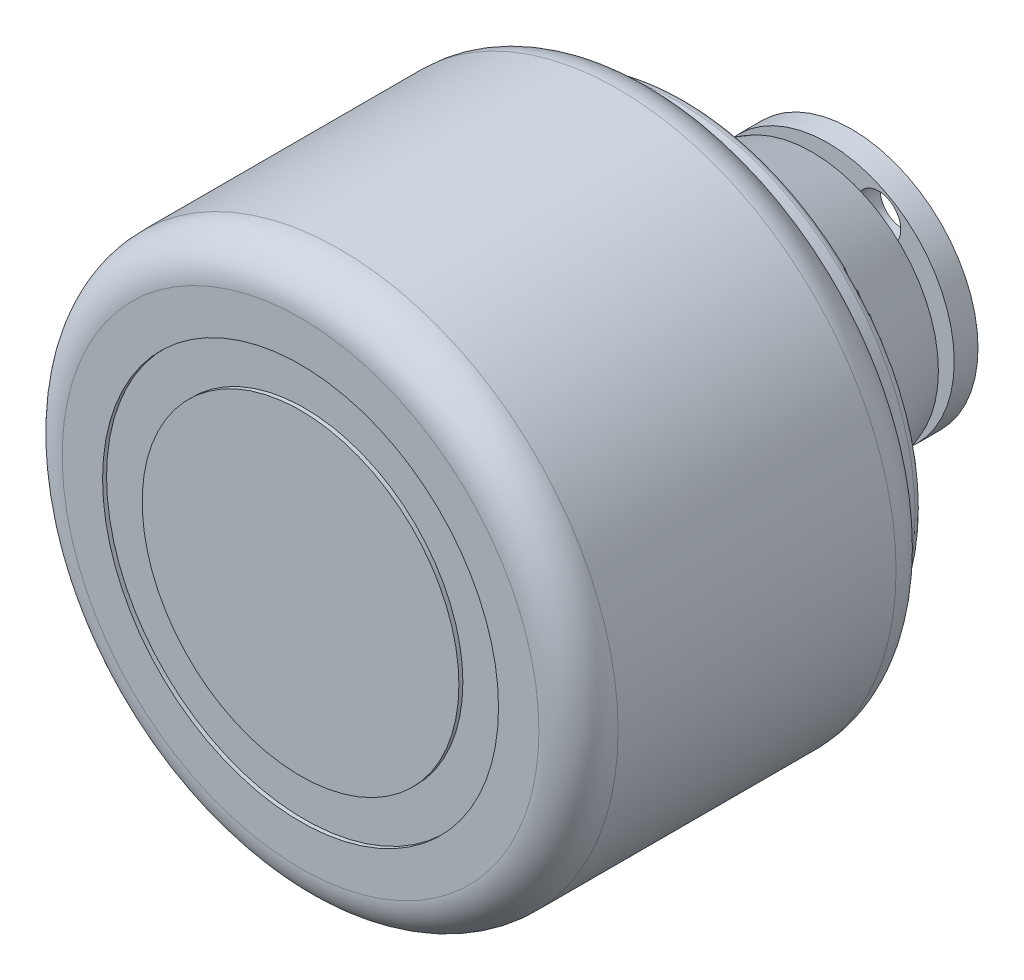
ISO-10303-21;
HEADER;
FILE_DESCRIPTION(('STEP AP214'),'2;1');
FILE_NAME('part.step','',(''),(''),'','','');
FILE_SCHEMA(('AUTOMOTIVE_DESIGN { 1 0 10303 214 1 1 1 1 }'));
ENDSEC;
DATA;
#1=APPLICATION_CONTEXT('core data for automotive mechanical design processes');
#2=APPLICATION_PROTOCOL_DEFINITION('international standard','automotive_design',2000,#1);
#3=PRODUCT_CONTEXT('',#1,'mechanical');
#4=PRODUCT('Part','Part','',(#3));
#5=PRODUCT_RELATED_PRODUCT_CATEGORY('part','',(#4));
#6=PRODUCT_DEFINITION_FORMATION('','',#4);
#7=PRODUCT_DEFINITION_CONTEXT('part definition',#1,'design');
#8=PRODUCT_DEFINITION('design','',#6,#7);
#9=PRODUCT_DEFINITION_SHAPE('','',#8);
#10=(LENGTH_UNIT() NAMED_UNIT(*) SI_UNIT(.MILLI.,.METRE.));
#11=(NAMED_UNIT(*) PLANE_ANGLE_UNIT() SI_UNIT($,.RADIAN.));
#12=(NAMED_UNIT(*) SI_UNIT($,.STERADIAN.) SOLID_ANGLE_UNIT());
#13=UNCERTAINTY_MEASURE_WITH_UNIT(LENGTH_MEASURE(1.E-05),#10,'distance_accuracy_value','');
#14=(GEOMETRIC_REPRESENTATION_CONTEXT(3) GLOBAL_UNCERTAINTY_ASSIGNED_CONTEXT((#13)) GLOBAL_UNIT_ASSIGNED_CONTEXT((#10,
#11,#12)) REPRESENTATION_CONTEXT('',''));
#15=CARTESIAN_POINT('',(0.,0.,0.));
#16=DIRECTION('',(0.,0.,1.));
#17=DIRECTION('',(1.,0.,0.));
#18=AXIS2_PLACEMENT_3D('',#15,#16,#17);
#19=CARTESIAN_POINT('',(0.,0.,45.1));
#20=DIRECTION('',(0.,0.,-1.));
#21=DIRECTION('',(-1.,0.,0.));
#22=AXIS2_PLACEMENT_3D('',#19,#20,#21);
#23=CYLINDRICAL_SURFACE('',#22,35.1);
#24=CARTESIAN_POINT('',(0.,0.,40.1));
#25=DIRECTION('',(0.,0.,1.));
#26=DIRECTION('',(1.,0.,0.));
#27=AXIS2_PLACEMENT_3D('',#24,#25,#26);
#28=CIRCLE('',#27,35.1);
#29=CARTESIAN_POINT('',(35.1,0.,40.1));
#30=VERTEX_POINT('',#29);
#31=EDGE_CURVE('E65',#30,#30,#28,.F.);
#32=ORIENTED_EDGE('',*,*,#31,.T.);
#33=EDGE_LOOP('',(#32));
#34=FACE_BOUND('',#33,.T.);
#35=CARTESIAN_POINT('',(0.,0.,5.));
#36=DIRECTION('',(0.,0.,1.));
#37=DIRECTION('',(1.,0.,0.));
#38=AXIS2_PLACEMENT_3D('',#35,#36,#37);
#39=CIRCLE('',#38,35.1);
#40=CARTESIAN_POINT('',(35.1,0.,5.));
#41=VERTEX_POINT('',#40);
#42=EDGE_CURVE('E68',#41,#41,#39,.T.);
#43=ORIENTED_EDGE('',*,*,#42,.T.);
#44=EDGE_LOOP('',(#43));
#45=FACE_BOUND('',#44,.T.);
#46=ADVANCED_FACE('F42',(#34,#45),#23,.T.);
#47=CARTESIAN_POINT('',(0.,0.,45.1));
#48=DIRECTION('',(0.,0.,1.));
#49=DIRECTION('',(1.,0.,0.));
#50=AXIS2_PLACEMENT_3D('',#47,#48,#49);
#51=PLANE('',#50);
#52=CARTESIAN_POINT('',(0.,0.,45.1));
#53=DIRECTION('',(0.,0.,1.));
#54=DIRECTION('',(1.,0.,0.));
#55=AXIS2_PLACEMENT_3D('',#52,#53,#54);
#56=CIRCLE('',#55,25.);
#57=CARTESIAN_POINT('',(25.,0.,45.1));
#58=VERTEX_POINT('',#57);
#59=EDGE_CURVE('E114',#58,#58,#56,.T.);
#60=ORIENTED_EDGE('',*,*,#59,.F.);
#61=EDGE_LOOP('',(#60));
#62=FACE_BOUND('',#61,.T.);
#63=CARTESIAN_POINT('',(0.,0.,45.1));
#64=DIRECTION('',(0.,0.,1.));
#65=DIRECTION('',(1.,0.,0.));
#66=AXIS2_PLACEMENT_3D('',#63,#64,#65);
#67=CIRCLE('',#66,30.1);
#68=CARTESIAN_POINT('',(30.1,0.,45.1));
#69=VERTEX_POINT('',#68);
#70=EDGE_CURVE('E71',#69,#69,#67,.T.);
#71=ORIENTED_EDGE('',*,*,#70,.T.);
#72=EDGE_LOOP('',(#71));
#73=FACE_BOUND('',#72,.T.);
#74=ADVANCED_FACE('F142',(#62,#73),#51,.T.);
#75=CARTESIAN_POINT('',(0.,0.,0.));
#76=DIRECTION('',(0.,0.,1.));
#77=DIRECTION('',(1.,0.,0.));
#78=AXIS2_PLACEMENT_3D('',#75,#76,#77);
#79=PLANE('',#78);
#80=CARTESIAN_POINT('',(0.,0.,0.));
#81=DIRECTION('',(0.,0.,1.));
#82=DIRECTION('',(1.,0.,0.));
#83=AXIS2_PLACEMENT_3D('',#80,#81,#82);
#84=CIRCLE('',#83,30.1);
#85=CARTESIAN_POINT('',(30.1,0.,0.));
#86=VERTEX_POINT('',#85);
#87=EDGE_CURVE('E62',#86,#86,#84,.F.);
#88=ORIENTED_EDGE('',*,*,#87,.T.);
#89=EDGE_LOOP('',(#88));
#90=FACE_BOUND('',#89,.T.);
#91=CARTESIAN_POINT('',(0.,0.,0.));
#92=DIRECTION('',(0.,0.,1.));
#93=DIRECTION('',(1.,0.,0.));
#94=AXIS2_PLACEMENT_3D('',#91,#92,#93);
#95=CIRCLE('',#94,30.);
#96=CARTESIAN_POINT('',(30.,0.,0.));
#97=VERTEX_POINT('',#96);
#98=EDGE_CURVE('E74',#97,#97,#95,.T.);
#99=ORIENTED_EDGE('',*,*,#98,.T.);
#100=EDGE_LOOP('',(#99));
#101=FACE_BOUND('',#100,.T.);
#102=ADVANCED_FACE('F145',(#90,#101),#79,.F.);
#103=CARTESIAN_POINT('',(0.,0.,-3.5));
#104=DIRECTION('',(0.,0.,1.));
#105=DIRECTION('',(1.,0.,0.));
#106=AXIS2_PLACEMENT_3D('',#103,#104,#105);
#107=CYLINDRICAL_SURFACE('',#106,30.);
#108=CARTESIAN_POINT('',(0.,0.,-2.5));
#109=DIRECTION('',(0.,0.,1.));
#110=DIRECTION('',(1.,0.,0.));
#111=AXIS2_PLACEMENT_3D('',#108,#109,#110);
#112=CIRCLE('',#111,30.);
#113=CARTESIAN_POINT('',(30.,0.,-2.5));
#114=VERTEX_POINT('',#113);
#115=EDGE_CURVE('E49',#114,#114,#112,.T.);
#116=ORIENTED_EDGE('',*,*,#115,.T.);
#117=EDGE_LOOP('',(#116));
#118=FACE_BOUND('',#117,.T.);
#119=ORIENTED_EDGE('',*,*,#98,.F.);
#120=EDGE_LOOP('',(#119));
#121=FACE_BOUND('',#120,.T.);
#122=ADVANCED_FACE('F175',(#118,#121),#107,.T.);
#123=CARTESIAN_POINT('',(0.,0.,-3.5));
#124=DIRECTION('',(0.,0.,1.));
#125=DIRECTION('',(1.,0.,0.));
#126=AXIS2_PLACEMENT_3D('',#123,#124,#125);
#127=PLANE('',#126);
#128=CARTESIAN_POINT('',(0.,0.,-3.5));
#129=DIRECTION('',(0.,0.,1.));
#130=DIRECTION('',(1.,0.,0.));
#131=AXIS2_PLACEMENT_3D('',#128,#129,#130);
#132=CIRCLE('',#131,29.);
#133=CARTESIAN_POINT('',(29.,0.,-3.5));
#134=VERTEX_POINT('',#133);
#135=EDGE_CURVE('E12',#134,#134,#132,.F.);
#136=ORIENTED_EDGE('',*,*,#135,.T.);
#137=EDGE_LOOP('',(#136));
#138=FACE_BOUND('',#137,.T.);
#139=CARTESIAN_POINT('',(0.,0.,-3.5));
#140=DIRECTION('',(0.,0.,1.));
#141=DIRECTION('',(1.,0.,0.));
#142=AXIS2_PLACEMENT_3D('',#139,#140,#141);
#143=CIRCLE('',#142,20.);
#144=CARTESIAN_POINT('',(20.,0.,-3.5));
#145=VERTEX_POINT('',#144);
#146=EDGE_CURVE('E77',#145,#145,#143,.T.);
#147=ORIENTED_EDGE('',*,*,#146,.T.);
#148=EDGE_LOOP('',(#147));
#149=FACE_BOUND('',#148,.T.);
#150=ADVANCED_FACE('F180',(#138,#149),#127,.F.);
#151=CARTESIAN_POINT('',(0.,0.,-24.5));
#152=DIRECTION('',(0.,0.,1.));
#153=DIRECTION('',(1.,0.,0.));
#154=AXIS2_PLACEMENT_3D('',#151,#152,#153);
#155=CYLINDRICAL_SURFACE('',#154,20.);
#156=CARTESIAN_POINT('',(0.,0.,-4.2159957694468));
#157=DIRECTION('',(0.,0.,1.));
#158=DIRECTION('',(1.,0.,0.));
#159=AXIS2_PLACEMENT_3D('',#156,#157,#158);
#160=CIRCLE('',#159,20.);
#161=CARTESIAN_POINT('',(20.,0.,-4.2159957694468));
#162=VERTEX_POINT('',#161);
#163=EDGE_CURVE('E57',#162,#162,#160,.T.);
#164=ORIENTED_EDGE('',*,*,#163,.T.);
#165=EDGE_LOOP('',(#164));
#166=FACE_BOUND('',#165,.T.);
#167=ORIENTED_EDGE('',*,*,#146,.F.);
#168=EDGE_LOOP('',(#167));
#169=FACE_BOUND('',#168,.T.);
#170=ADVANCED_FACE('F183',(#166,#169),#155,.T.);
#171=CARTESIAN_POINT('',(0.,0.,-24.5));
#172=DIRECTION('',(0.,0.,1.));
#173=DIRECTION('',(1.,0.,0.));
#174=AXIS2_PLACEMENT_3D('',#171,#172,#173);
#175=CYLINDRICAL_SURFACE('',#174,4.);
#176=CARTESIAN_POINT('',(0.,0.,-19.5));
#177=DIRECTION('',(0.,0.,1.));
#178=DIRECTION('',(1.,0.,0.));
#179=AXIS2_PLACEMENT_3D('',#176,#177,#178);
#180=CIRCLE('',#179,4.);
#181=CARTESIAN_POINT('',(4.,0.,-19.5));
#182=VERTEX_POINT('',#181);
#183=EDGE_CURVE('E92',#182,#182,#180,.T.);
#184=ORIENTED_EDGE('',*,*,#183,.F.);
#185=EDGE_LOOP('',(#184));
#186=FACE_BOUND('',#185,.T.);
#187=CARTESIAN_POINT('',(0.,0.,-21.5));
#188=DIRECTION('',(0.,0.,1.));
#189=DIRECTION('',(1.,0.,0.));
#190=AXIS2_PLACEMENT_3D('',#187,#188,#189);
#191=CIRCLE('',#190,4.);
#192=CARTESIAN_POINT('',(4.,0.,-21.5));
#193=VERTEX_POINT('',#192);
#194=EDGE_CURVE('E80',#193,#193,#191,.T.);
#195=ORIENTED_EDGE('',*,*,#194,.T.);
#196=EDGE_LOOP('',(#195));
#197=FACE_BOUND('',#196,.T.);
#198=ADVANCED_FACE('F185',(#186,#197),#175,.T.);
#199=CARTESIAN_POINT('',(0.,0.,-21.5));
#200=DIRECTION('',(0.,0.,-1.));
#201=DIRECTION('',(-1.,0.,0.));
#202=AXIS2_PLACEMENT_3D('',#199,#200,#201);
#203=PLANE('',#202);
#204=CARTESIAN_POINT('',(-12.8,0.,-21.5));
#205=DIRECTION('',(0.,0.,-1.));
#206=DIRECTION('',(-1.,0.,0.));
#207=AXIS2_PLACEMENT_3D('',#204,#205,#206);
#208=CIRCLE('',#207,2.8);
#209=CARTESIAN_POINT('',(-15.6,0.,-21.5));
#210=VERTEX_POINT('',#209);
#211=EDGE_CURVE('E95',#210,#210,#208,.T.);
#212=ORIENTED_EDGE('',*,*,#211,.T.);
#213=EDGE_LOOP('',(#212));
#214=FACE_BOUND('',#213,.T.);
#215=CARTESIAN_POINT('',(6.40000000000001,11.0851251684408,-21.5));
#216=DIRECTION('',(0.,0.,-1.));
#217=DIRECTION('',(-1.,0.,0.));
#218=AXIS2_PLACEMENT_3D('',#215,#216,#217);
#219=CIRCLE('',#218,2.8);
#220=CARTESIAN_POINT('',(3.60000000000001,11.0851251684408,-21.5));
#221=VERTEX_POINT('',#220);
#222=EDGE_CURVE('E98',#221,#221,#219,.T.);
#223=ORIENTED_EDGE('',*,*,#222,.T.);
#224=EDGE_LOOP('',(#223));
#225=FACE_BOUND('',#224,.T.);
#226=CARTESIAN_POINT('',(6.4,-11.0851251684408,-21.5));
#227=DIRECTION('',(0.,0.,-1.));
#228=DIRECTION('',(-1.,0.,0.));
#229=AXIS2_PLACEMENT_3D('',#226,#227,#228);
#230=CIRCLE('',#229,2.8);
#231=CARTESIAN_POINT('',(3.6,-11.0851251684408,-21.5));
#232=VERTEX_POINT('',#231);
#233=EDGE_CURVE('E101',#232,#232,#230,.T.);
#234=ORIENTED_EDGE('',*,*,#233,.T.);
#235=EDGE_LOOP('',(#234));
#236=FACE_BOUND('',#235,.T.);
#237=ORIENTED_EDGE('',*,*,#194,.F.);
#238=EDGE_LOOP('',(#237));
#239=FACE_BOUND('',#238,.T.);
#240=CARTESIAN_POINT('',(0.,0.,-21.5));
#241=DIRECTION('',(0.,0.,1.));
#242=DIRECTION('',(1.,0.,0.));
#243=AXIS2_PLACEMENT_3D('',#240,#241,#242);
#244=CIRCLE('',#243,15.95);
#245=CARTESIAN_POINT('',(15.95,0.,-21.5));
#246=VERTEX_POINT('',#245);
#247=EDGE_CURVE('E83',#246,#246,#244,.T.);
#248=ORIENTED_EDGE('',*,*,#247,.T.);
#249=EDGE_LOOP('',(#248));
#250=FACE_BOUND('',#249,.T.);
#251=ADVANCED_FACE('F190',(#214,#225,#236,#239,#250),#203,.F.);
#252=CARTESIAN_POINT('',(0.,0.,-24.5));
#253=DIRECTION('',(0.,0.,1.));
#254=DIRECTION('',(1.,0.,0.));
#255=AXIS2_PLACEMENT_3D('',#252,#253,#254);
#256=CYLINDRICAL_SURFACE('',#255,15.95);
#257=ORIENTED_EDGE('',*,*,#247,.F.);
#258=EDGE_LOOP('',(#257));
#259=FACE_BOUND('',#258,.T.);
#260=CARTESIAN_POINT('',(0.,0.,-24.5));
#261=DIRECTION('',(0.,0.,1.));
#262=DIRECTION('',(1.,0.,0.));
#263=AXIS2_PLACEMENT_3D('',#260,#261,#262);
#264=CIRCLE('',#263,15.95);
#265=CARTESIAN_POINT('',(15.95,0.,-24.5));
#266=VERTEX_POINT('',#265);
#267=EDGE_CURVE('E86',#266,#266,#264,.T.);
#268=ORIENTED_EDGE('',*,*,#267,.T.);
#269=EDGE_LOOP('',(#268));
#270=FACE_BOUND('',#269,.T.);
#271=ADVANCED_FACE('F194',(#259,#270),#256,.T.);
#272=CARTESIAN_POINT('',(0.,0.,-19.5));
#273=DIRECTION('',(0.,0.,1.));
#274=DIRECTION('',(1.,0.,0.));
#275=AXIS2_PLACEMENT_3D('',#272,#273,#274);
#276=CONICAL_SURFACE('',#275,15.95,0.325495855236478);
#277=CARTESIAN_POINT('',(0.,0.,-10.6115686526104));
#278=DIRECTION('',(0.,0.,1.));
#279=DIRECTION('',(1.,0.,0.));
#280=AXIS2_PLACEMENT_3D('',#277,#278,#279);
#281=CIRCLE('',#280,18.949845579744);
#282=CARTESIAN_POINT('',(18.949845579744,0.,-10.6115686526104));
#283=VERTEX_POINT('',#282);
#284=EDGE_CURVE('E53',#283,#283,#281,.F.);
#285=ORIENTED_EDGE('',*,*,#284,.T.);
#286=EDGE_LOOP('',(#285));
#287=FACE_BOUND('',#286,.T.);
#288=CARTESIAN_POINT('',(0.,0.,-19.5));
#289=DIRECTION('',(0.,0.,1.));
#290=DIRECTION('',(1.,0.,0.));
#291=AXIS2_PLACEMENT_3D('',#288,#289,#290);
#292=CIRCLE('',#291,15.95);
#293=CARTESIAN_POINT('',(15.95,0.,-19.5));
#294=VERTEX_POINT('',#293);
#295=EDGE_CURVE('E89',#294,#294,#292,.T.);
#296=ORIENTED_EDGE('',*,*,#295,.T.);
#297=EDGE_LOOP('',(#296));
#298=FACE_BOUND('',#297,.T.);
#299=ADVANCED_FACE('F198',(#287,#298),#276,.T.);
#300=CARTESIAN_POINT('',(0.,0.,-19.5));
#301=DIRECTION('',(0.,0.,1.));
#302=DIRECTION('',(1.,0.,0.));
#303=AXIS2_PLACEMENT_3D('',#300,#301,#302);
#304=PLANE('',#303);
#305=ORIENTED_EDGE('',*,*,#295,.F.);
#306=EDGE_LOOP('',(#305));
#307=FACE_BOUND('',#306,.T.);
#308=ORIENTED_EDGE('',*,*,#183,.T.);
#309=EDGE_LOOP('',(#308));
#310=FACE_BOUND('',#309,.T.);
#311=ADVANCED_FACE('F163',(#307,#310),#304,.F.);
#312=CARTESIAN_POINT('',(0.,0.,-24.5));
#313=DIRECTION('',(0.,0.,1.));
#314=DIRECTION('',(1.,0.,0.));
#315=AXIS2_PLACEMENT_3D('',#312,#313,#314);
#316=PLANE('',#315);
#317=CARTESIAN_POINT('',(-12.8,0.,-24.5));
#318=DIRECTION('',(0.,0.,-1.));
#319=DIRECTION('',(-1.,0.,0.));
#320=AXIS2_PLACEMENT_3D('',#317,#318,#319);
#321=CIRCLE('',#320,2.8);
#322=CARTESIAN_POINT('',(-15.6,0.,-24.5));
#323=VERTEX_POINT('',#322);
#324=EDGE_CURVE('E104',#323,#323,#321,.T.);
#325=ORIENTED_EDGE('',*,*,#324,.F.);
#326=EDGE_LOOP('',(#325));
#327=FACE_BOUND('',#326,.T.);
#328=CARTESIAN_POINT('',(6.40000000000001,11.0851251684408,-24.5));
#329=DIRECTION('',(0.,0.,-1.));
#330=DIRECTION('',(-1.,0.,0.));
#331=AXIS2_PLACEMENT_3D('',#328,#329,#330);
#332=CIRCLE('',#331,2.8);
#333=CARTESIAN_POINT('',(3.60000000000001,11.0851251684408,-24.5));
#334=VERTEX_POINT('',#333);
#335=EDGE_CURVE('E108',#334,#334,#332,.T.);
#336=ORIENTED_EDGE('',*,*,#335,.F.);
#337=EDGE_LOOP('',(#336));
#338=FACE_BOUND('',#337,.T.);
#339=CARTESIAN_POINT('',(6.4,-11.0851251684408,-24.5));
#340=DIRECTION('',(0.,0.,-1.));
#341=DIRECTION('',(-1.,0.,0.));
#342=AXIS2_PLACEMENT_3D('',#339,#340,#341);
#343=CIRCLE('',#342,2.8);
#344=CARTESIAN_POINT('',(3.6,-11.0851251684408,-24.5));
#345=VERTEX_POINT('',#344);
#346=EDGE_CURVE('E105',#345,#345,#343,.T.);
#347=ORIENTED_EDGE('',*,*,#346,.F.);
#348=EDGE_LOOP('',(#347));
#349=FACE_BOUND('',#348,.T.);
#350=ORIENTED_EDGE('',*,*,#267,.F.);
#351=EDGE_LOOP('',(#350));
#352=FACE_BOUND('',#351,.T.);
#353=ADVANCED_FACE('F153',(#327,#338,#349,#352),#316,.F.);
#354=CARTESIAN_POINT('',(0.,0.,40.1));
#355=DIRECTION('',(0.,0.,1.));
#356=DIRECTION('',(1.,0.,0.));
#357=AXIS2_PLACEMENT_3D('',#354,#355,#356);
#358=TOROIDAL_SURFACE('',#357,30.1,5.);
#359=ORIENTED_EDGE('',*,*,#31,.F.);
#360=EDGE_LOOP('',(#359));
#361=FACE_BOUND('',#360,.T.);
#362=ORIENTED_EDGE('',*,*,#70,.F.);
#363=EDGE_LOOP('',(#362));
#364=FACE_BOUND('',#363,.T.);
#365=ADVANCED_FACE('F150',(#361,#364),#358,.T.);
#366=CARTESIAN_POINT('',(0.,0.,5.));
#367=DIRECTION('',(0.,0.,1.));
#368=DIRECTION('',(1.,0.,0.));
#369=AXIS2_PLACEMENT_3D('',#366,#367,#368);
#370=TOROIDAL_SURFACE('',#369,30.1,5.);
#371=ORIENTED_EDGE('',*,*,#87,.F.);
#372=EDGE_LOOP('',(#371));
#373=FACE_BOUND('',#372,.T.);
#374=ORIENTED_EDGE('',*,*,#42,.F.);
#375=EDGE_LOOP('',(#374));
#376=FACE_BOUND('',#375,.T.);
#377=ADVANCED_FACE('F152',(#373,#376),#370,.T.);
#378=CARTESIAN_POINT('',(0.,0.,-4.2159957694468));
#379=DIRECTION('',(0.,0.,1.));
#380=DIRECTION('',(1.,0.,0.));
#381=AXIS2_PLACEMENT_3D('',#378,#379,#380);
#382=SPHERICAL_SURFACE('',#381,20.);
#383=ORIENTED_EDGE('',*,*,#284,.F.);
#384=EDGE_LOOP('',(#383));
#385=FACE_BOUND('',#384,.T.);
#386=ORIENTED_EDGE('',*,*,#163,.F.);
#387=EDGE_LOOP('',(#386));
#388=FACE_BOUND('',#387,.T.);
#389=ADVANCED_FACE('F160',(#385,#388),#382,.T.);
#390=CARTESIAN_POINT('',(0.,0.,-2.5));
#391=DIRECTION('',(0.,0.,1.));
#392=DIRECTION('',(1.,0.,0.));
#393=AXIS2_PLACEMENT_3D('',#390,#391,#392);
#394=TOROIDAL_SURFACE('',#393,29.,1.);
#395=ORIENTED_EDGE('',*,*,#135,.F.);
#396=EDGE_LOOP('',(#395));
#397=FACE_BOUND('',#396,.T.);
#398=ORIENTED_EDGE('',*,*,#115,.F.);
#399=EDGE_LOOP('',(#398));
#400=FACE_BOUND('',#399,.T.);
#401=ADVANCED_FACE('F44',(#397,#400),#394,.T.);
#402=CARTESIAN_POINT('',(6.4,-11.0851251684408,-20.5));
#403=DIRECTION('',(0.,0.,-1.));
#404=DIRECTION('',(-1.,0.,0.));
#405=AXIS2_PLACEMENT_3D('',#402,#403,#404);
#406=CYLINDRICAL_SURFACE('',#405,2.8);
#407=ORIENTED_EDGE('',*,*,#346,.T.);
#408=EDGE_LOOP('',(#407));
#409=FACE_BOUND('',#408,.T.);
#410=ORIENTED_EDGE('',*,*,#233,.F.);
#411=EDGE_LOOP('',(#410));
#412=FACE_BOUND('',#411,.T.);
#413=ADVANCED_FACE('F206',(#409,#412),#406,.F.);
#414=CARTESIAN_POINT('',(6.40000000000001,11.0851251684408,-20.5));
#415=DIRECTION('',(0.,0.,-1.));
#416=DIRECTION('',(-1.,0.,0.));
#417=AXIS2_PLACEMENT_3D('',#414,#415,#416);
#418=CYLINDRICAL_SURFACE('',#417,2.8);
#419=ORIENTED_EDGE('',*,*,#335,.T.);
#420=EDGE_LOOP('',(#419));
#421=FACE_BOUND('',#420,.T.);
#422=ORIENTED_EDGE('',*,*,#222,.F.);
#423=EDGE_LOOP('',(#422));
#424=FACE_BOUND('',#423,.T.);
#425=ADVANCED_FACE('F209',(#421,#424),#418,.F.);
#426=CARTESIAN_POINT('',(-12.8,0.,-20.5));
#427=DIRECTION('',(0.,0.,-1.));
#428=DIRECTION('',(-1.,0.,0.));
#429=AXIS2_PLACEMENT_3D('',#426,#427,#428);
#430=CYLINDRICAL_SURFACE('',#429,2.8);
#431=ORIENTED_EDGE('',*,*,#324,.T.);
#432=EDGE_LOOP('',(#431));
#433=FACE_BOUND('',#432,.T.);
#434=ORIENTED_EDGE('',*,*,#211,.F.);
#435=EDGE_LOOP('',(#434));
#436=FACE_BOUND('',#435,.T.);
#437=ADVANCED_FACE('F138',(#433,#436),#430,.F.);
#438=CARTESIAN_POINT('',(0.,0.,44.6));
#439=DIRECTION('',(0.,0.,1.));
#440=DIRECTION('',(1.,0.,0.));
#441=AXIS2_PLACEMENT_3D('',#438,#439,#440);
#442=CYLINDRICAL_SURFACE('',#441,25.);
#443=CARTESIAN_POINT('',(0.,0.,44.6));
#444=DIRECTION('',(0.,0.,1.));
#445=DIRECTION('',(1.,0.,0.));
#446=AXIS2_PLACEMENT_3D('',#443,#444,#445);
#447=CIRCLE('',#446,25.);
#448=CARTESIAN_POINT('',(25.,0.,44.6));
#449=VERTEX_POINT('',#448);
#450=EDGE_CURVE('E109',#449,#449,#447,.T.);
#451=ORIENTED_EDGE('',*,*,#450,.F.);
#452=EDGE_LOOP('',(#451));
#453=FACE_BOUND('',#452,.T.);
#454=ORIENTED_EDGE('',*,*,#59,.T.);
#455=EDGE_LOOP('',(#454));
#456=FACE_BOUND('',#455,.T.);
#457=ADVANCED_FACE('F132',(#453,#456),#442,.F.);
#458=CARTESIAN_POINT('',(0.,0.,44.6));
#459=DIRECTION('',(0.,0.,1.));
#460=DIRECTION('',(1.,0.,0.));
#461=AXIS2_PLACEMENT_3D('',#458,#459,#460);
#462=PLANE('',#461);
#463=CARTESIAN_POINT('',(0.,0.,44.6));
#464=DIRECTION('',(0.,0.,1.));
#465=DIRECTION('',(1.,0.,0.));
#466=AXIS2_PLACEMENT_3D('',#463,#464,#465);
#467=CIRCLE('',#466,20.);
#468=CARTESIAN_POINT('',(20.,0.,44.6));
#469=VERTEX_POINT('',#468);
#470=EDGE_CURVE('E117',#469,#469,#467,.T.);
#471=ORIENTED_EDGE('',*,*,#470,.F.);
#472=EDGE_LOOP('',(#471));
#473=FACE_BOUND('',#472,.T.);
#474=ORIENTED_EDGE('',*,*,#450,.T.);
#475=EDGE_LOOP('',(#474));
#476=FACE_BOUND('',#475,.T.);
#477=ADVANCED_FACE('F129',(#473,#476),#462,.T.);
#478=CARTESIAN_POINT('',(0.,0.,44.6));
#479=DIRECTION('',(0.,0.,1.));
#480=DIRECTION('',(1.,0.,0.));
#481=AXIS2_PLACEMENT_3D('',#478,#479,#480);
#482=CYLINDRICAL_SURFACE('',#481,20.);
#483=ORIENTED_EDGE('',*,*,#470,.T.);
#484=EDGE_LOOP('',(#483));
#485=FACE_BOUND('',#484,.T.);
#486=CARTESIAN_POINT('',(0.,0.,45.1));
#487=DIRECTION('',(0.,0.,1.));
#488=DIRECTION('',(1.,0.,0.));
#489=AXIS2_PLACEMENT_3D('',#486,#487,#488);
#490=CIRCLE('',#489,20.);
#491=CARTESIAN_POINT('',(20.,0.,45.1));
#492=VERTEX_POINT('',#491);
#493=EDGE_CURVE('E120',#492,#492,#490,.T.);
#494=ORIENTED_EDGE('',*,*,#493,.F.);
#495=EDGE_LOOP('',(#494));
#496=FACE_BOUND('',#495,.T.);
#497=ADVANCED_FACE('F126',(#485,#496),#482,.T.);
#498=ORIENTED_EDGE('',*,*,#493,.T.);
#499=EDGE_LOOP('',(#498));
#500=FACE_BOUND('',#499,.T.);
#501=ADVANCED_FACE('F147',(#500),#51,.T.);
#502=CLOSED_SHELL('',(#46,#74,#102,#122,#150,#170,#198,#251,#271,#299,#311,#353,#365,#377,#389,
#401,#413,#425,#437,#457,#477,#497,#501));
#503=MANIFOLD_SOLID_BREP('B2',#502);
#504=ADVANCED_BREP_SHAPE_REPRESENTATION('',(#18,#503),#14);
#505=SHAPE_DEFINITION_REPRESENTATION(#9,#504);
ENDSEC;
END-ISO-10303-21;
